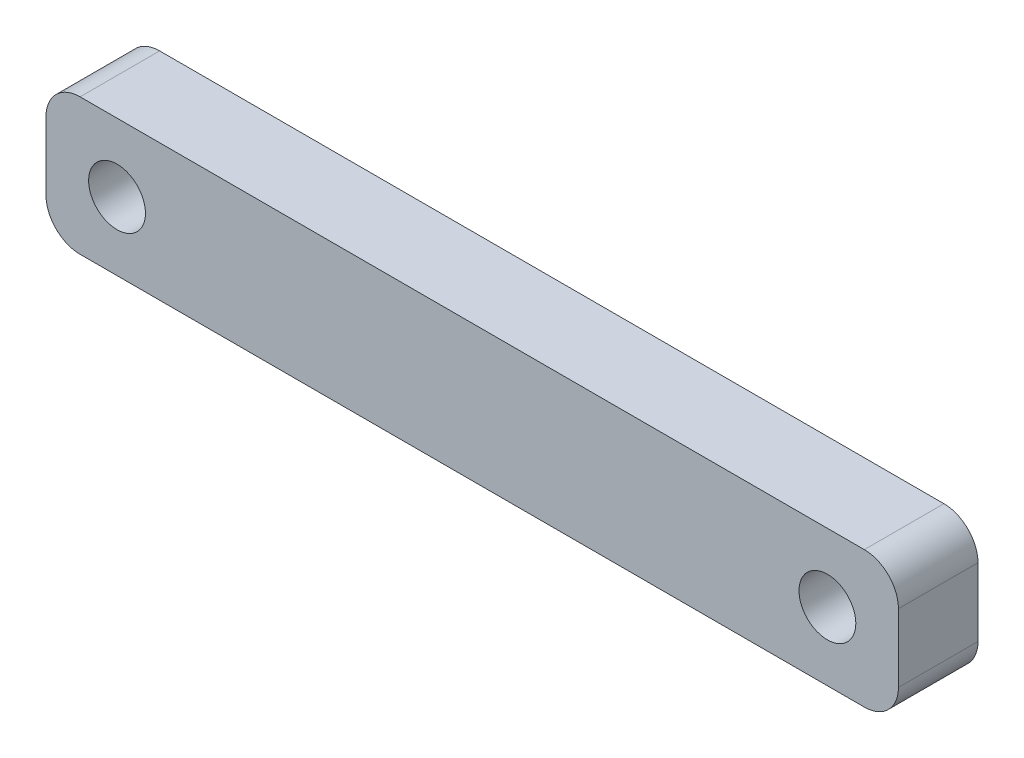
ISO-10303-21;
HEADER;
FILE_DESCRIPTION(('STEP AP214'),'2;1');
FILE_NAME('part.step','',(''),(''),'','','');
FILE_SCHEMA(('AUTOMOTIVE_DESIGN { 1 0 10303 214 1 1 1 1 }'));
ENDSEC;
DATA;
#1=APPLICATION_CONTEXT('core data for automotive mechanical design processes');
#2=APPLICATION_PROTOCOL_DEFINITION('international standard','automotive_design',2000,#1);
#3=PRODUCT_CONTEXT('',#1,'mechanical');
#4=PRODUCT('Part','Part','',(#3));
#5=PRODUCT_RELATED_PRODUCT_CATEGORY('part','',(#4));
#6=PRODUCT_DEFINITION_FORMATION('','',#4);
#7=PRODUCT_DEFINITION_CONTEXT('part definition',#1,'design');
#8=PRODUCT_DEFINITION('design','',#6,#7);
#9=PRODUCT_DEFINITION_SHAPE('','',#8);
#10=(LENGTH_UNIT() NAMED_UNIT(*) SI_UNIT(.MILLI.,.METRE.));
#11=(NAMED_UNIT(*) PLANE_ANGLE_UNIT() SI_UNIT($,.RADIAN.));
#12=(NAMED_UNIT(*) SI_UNIT($,.STERADIAN.) SOLID_ANGLE_UNIT());
#13=UNCERTAINTY_MEASURE_WITH_UNIT(LENGTH_MEASURE(1.E-05),#10,'distance_accuracy_value','');
#14=(GEOMETRIC_REPRESENTATION_CONTEXT(3) GLOBAL_UNCERTAINTY_ASSIGNED_CONTEXT((#13)) GLOBAL_UNIT_ASSIGNED_CONTEXT((#10,
#11,#12)) REPRESENTATION_CONTEXT('',''));
#15=CARTESIAN_POINT('',(0.,0.,0.));
#16=DIRECTION('',(0.,0.,1.));
#17=DIRECTION('',(1.,0.,0.));
#18=AXIS2_PLACEMENT_3D('',#15,#16,#17);
#19=CARTESIAN_POINT('',(0.,0.,7.));
#20=DIRECTION('',(0.,0.,-1.));
#21=DIRECTION('',(-1.,0.,0.));
#22=AXIS2_PLACEMENT_3D('',#19,#20,#21);
#23=PLANE('',#22);
#24=DIRECTION('',(0.,-1.,0.));
#25=VECTOR('',#24,1.);
#26=CARTESIAN_POINT('',(-37.5,-6.,7.));
#27=LINE('',#26,#25);
#28=CARTESIAN_POINT('',(-37.5,3.,7.));
#29=VERTEX_POINT('',#28);
#30=CARTESIAN_POINT('',(-37.5,-3.,7.));
#31=VERTEX_POINT('',#30);
#32=EDGE_CURVE('E172',#29,#31,#27,.T.);
#33=ORIENTED_EDGE('',*,*,#32,.T.);
#34=CARTESIAN_POINT('',(-34.5,-3.,7.));
#35=DIRECTION('',(0.,0.,-1.));
#36=DIRECTION('',(-1.,0.,0.));
#37=AXIS2_PLACEMENT_3D('',#34,#35,#36);
#38=CIRCLE('',#37,3.);
#39=CARTESIAN_POINT('',(-34.5,-6.,7.));
#40=VERTEX_POINT('',#39);
#41=EDGE_CURVE('E149',#31,#40,#38,.F.);
#42=ORIENTED_EDGE('',*,*,#41,.T.);
#43=DIRECTION('',(1.,0.,0.));
#44=VECTOR('',#43,1.);
#45=CARTESIAN_POINT('',(-37.5,-6.,7.));
#46=LINE('',#45,#44);
#47=CARTESIAN_POINT('',(34.5,-6.,7.));
#48=VERTEX_POINT('',#47);
#49=EDGE_CURVE('E120',#40,#48,#46,.T.);
#50=ORIENTED_EDGE('',*,*,#49,.T.);
#51=CARTESIAN_POINT('',(34.5,-3.,7.));
#52=DIRECTION('',(0.,0.,-1.));
#53=DIRECTION('',(-1.,0.,0.));
#54=AXIS2_PLACEMENT_3D('',#51,#52,#53);
#55=CIRCLE('',#54,3.);
#56=CARTESIAN_POINT('',(37.5,-3.,7.));
#57=VERTEX_POINT('',#56);
#58=EDGE_CURVE('E145',#48,#57,#55,.F.);
#59=ORIENTED_EDGE('',*,*,#58,.T.);
#60=DIRECTION('',(0.,1.,0.));
#61=VECTOR('',#60,1.);
#62=CARTESIAN_POINT('',(37.5,-6.,7.));
#63=LINE('',#62,#61);
#64=CARTESIAN_POINT('',(37.5,3.,7.));
#65=VERTEX_POINT('',#64);
#66=EDGE_CURVE('E128',#57,#65,#63,.T.);
#67=ORIENTED_EDGE('',*,*,#66,.T.);
#68=CARTESIAN_POINT('',(34.5,3.,7.));
#69=DIRECTION('',(0.,0.,-1.));
#70=DIRECTION('',(-1.,0.,0.));
#71=AXIS2_PLACEMENT_3D('',#68,#69,#70);
#72=CIRCLE('',#71,3.);
#73=CARTESIAN_POINT('',(34.5,6.,7.));
#74=VERTEX_POINT('',#73);
#75=EDGE_CURVE('E55',#65,#74,#72,.F.);
#76=ORIENTED_EDGE('',*,*,#75,.T.);
#77=DIRECTION('',(-1.,0.,0.));
#78=VECTOR('',#77,1.);
#79=CARTESIAN_POINT('',(-37.5,6.,7.));
#80=LINE('',#79,#78);
#81=CARTESIAN_POINT('',(-34.5,6.,7.));
#82=VERTEX_POINT('',#81);
#83=EDGE_CURVE('E131',#74,#82,#80,.T.);
#84=ORIENTED_EDGE('',*,*,#83,.T.);
#85=CARTESIAN_POINT('',(-34.5,3.,7.));
#86=DIRECTION('',(0.,0.,-1.));
#87=DIRECTION('',(-1.,0.,0.));
#88=AXIS2_PLACEMENT_3D('',#85,#86,#87);
#89=CIRCLE('',#88,3.);
#90=EDGE_CURVE('E147',#82,#29,#89,.F.);
#91=ORIENTED_EDGE('',*,*,#90,.T.);
#92=EDGE_LOOP('',(#33,#42,#50,#59,#67,#76,#84,#91));
#93=FACE_BOUND('',#92,.T.);
#94=CARTESIAN_POINT('',(31.25,0.,7.));
#95=DIRECTION('',(0.,0.,1.));
#96=DIRECTION('',(1.,0.,0.));
#97=AXIS2_PLACEMENT_3D('',#94,#95,#96);
#98=CIRCLE('',#97,2.5);
#99=CARTESIAN_POINT('',(33.75,0.,7.));
#100=VERTEX_POINT('',#99);
#101=EDGE_CURVE('E168',#100,#100,#98,.T.);
#102=ORIENTED_EDGE('',*,*,#101,.F.);
#103=EDGE_LOOP('',(#102));
#104=FACE_BOUND('',#103,.T.);
#105=CARTESIAN_POINT('',(-31.25,0.,7.));
#106=DIRECTION('',(0.,0.,1.));
#107=DIRECTION('',(1.,0.,0.));
#108=AXIS2_PLACEMENT_3D('',#105,#106,#107);
#109=CIRCLE('',#108,2.5);
#110=CARTESIAN_POINT('',(-28.75,0.,7.));
#111=VERTEX_POINT('',#110);
#112=EDGE_CURVE('E178',#111,#111,#109,.T.);
#113=ORIENTED_EDGE('',*,*,#112,.F.);
#114=EDGE_LOOP('',(#113));
#115=FACE_BOUND('',#114,.T.);
#116=ADVANCED_FACE('F33',(#93,#104,#115),#23,.F.);
#117=CARTESIAN_POINT('',(0.,0.,0.));
#118=DIRECTION('',(0.,0.,-1.));
#119=DIRECTION('',(-1.,0.,0.));
#120=AXIS2_PLACEMENT_3D('',#117,#118,#119);
#121=PLANE('',#120);
#122=CARTESIAN_POINT('',(31.25,0.,0.));
#123=DIRECTION('',(0.,0.,1.));
#124=DIRECTION('',(1.,0.,0.));
#125=AXIS2_PLACEMENT_3D('',#122,#123,#124);
#126=CIRCLE('',#125,2.5);
#127=CARTESIAN_POINT('',(33.75,0.,0.));
#128=VERTEX_POINT('',#127);
#129=EDGE_CURVE('E175',#128,#128,#126,.T.);
#130=ORIENTED_EDGE('',*,*,#129,.T.);
#131=EDGE_LOOP('',(#130));
#132=FACE_BOUND('',#131,.T.);
#133=DIRECTION('',(1.,0.,0.));
#134=VECTOR('',#133,1.);
#135=CARTESIAN_POINT('',(-37.5,-6.,0.));
#136=LINE('',#135,#134);
#137=CARTESIAN_POINT('',(-34.5,-6.,0.));
#138=VERTEX_POINT('',#137);
#139=CARTESIAN_POINT('',(34.5,-6.,0.));
#140=VERTEX_POINT('',#139);
#141=EDGE_CURVE('E117',#138,#140,#136,.T.);
#142=ORIENTED_EDGE('',*,*,#141,.F.);
#143=CARTESIAN_POINT('',(-34.5,-3.,0.));
#144=DIRECTION('',(0.,0.,-1.));
#145=DIRECTION('',(-1.,0.,0.));
#146=AXIS2_PLACEMENT_3D('',#143,#144,#145);
#147=CIRCLE('',#146,3.);
#148=CARTESIAN_POINT('',(-37.5,-3.,0.));
#149=VERTEX_POINT('',#148);
#150=EDGE_CURVE('E100',#138,#149,#147,.T.);
#151=ORIENTED_EDGE('',*,*,#150,.T.);
#152=DIRECTION('',(0.,-1.,0.));
#153=VECTOR('',#152,1.);
#154=CARTESIAN_POINT('',(-37.5,-6.,0.));
#155=LINE('',#154,#153);
#156=CARTESIAN_POINT('',(-37.5,3.,0.));
#157=VERTEX_POINT('',#156);
#158=EDGE_CURVE('E129',#157,#149,#155,.T.);
#159=ORIENTED_EDGE('',*,*,#158,.F.);
#160=CARTESIAN_POINT('',(-34.5,3.,0.));
#161=DIRECTION('',(0.,0.,-1.));
#162=DIRECTION('',(-1.,0.,0.));
#163=AXIS2_PLACEMENT_3D('',#160,#161,#162);
#164=CIRCLE('',#163,3.);
#165=CARTESIAN_POINT('',(-34.5,6.,0.));
#166=VERTEX_POINT('',#165);
#167=EDGE_CURVE('E111',#157,#166,#164,.T.);
#168=ORIENTED_EDGE('',*,*,#167,.T.);
#169=DIRECTION('',(-1.,0.,0.));
#170=VECTOR('',#169,1.);
#171=CARTESIAN_POINT('',(-37.5,6.,0.));
#172=LINE('',#171,#170);
#173=CARTESIAN_POINT('',(34.5,6.,0.));
#174=VERTEX_POINT('',#173);
#175=EDGE_CURVE('E133',#174,#166,#172,.T.);
#176=ORIENTED_EDGE('',*,*,#175,.F.);
#177=CARTESIAN_POINT('',(34.5,3.,0.));
#178=DIRECTION('',(0.,0.,-1.));
#179=DIRECTION('',(-1.,0.,0.));
#180=AXIS2_PLACEMENT_3D('',#177,#178,#179);
#181=CIRCLE('',#180,3.);
#182=CARTESIAN_POINT('',(37.5,3.,0.));
#183=VERTEX_POINT('',#182);
#184=EDGE_CURVE('E121',#174,#183,#181,.T.);
#185=ORIENTED_EDGE('',*,*,#184,.T.);
#186=DIRECTION('',(0.,1.,0.));
#187=VECTOR('',#186,1.);
#188=CARTESIAN_POINT('',(37.5,-6.,0.));
#189=LINE('',#188,#187);
#190=CARTESIAN_POINT('',(37.5,-3.,0.));
#191=VERTEX_POINT('',#190);
#192=EDGE_CURVE('E160',#191,#183,#189,.T.);
#193=ORIENTED_EDGE('',*,*,#192,.F.);
#194=CARTESIAN_POINT('',(34.5,-3.,0.));
#195=DIRECTION('',(0.,0.,-1.));
#196=DIRECTION('',(-1.,0.,0.));
#197=AXIS2_PLACEMENT_3D('',#194,#195,#196);
#198=CIRCLE('',#197,3.);
#199=EDGE_CURVE('E127',#191,#140,#198,.T.);
#200=ORIENTED_EDGE('',*,*,#199,.T.);
#201=EDGE_LOOP('',(#142,#151,#159,#168,#176,#185,#193,#200));
#202=FACE_BOUND('',#201,.T.);
#203=CARTESIAN_POINT('',(-31.25,0.,0.));
#204=DIRECTION('',(0.,0.,1.));
#205=DIRECTION('',(1.,0.,0.));
#206=AXIS2_PLACEMENT_3D('',#203,#204,#205);
#207=CIRCLE('',#206,2.5);
#208=CARTESIAN_POINT('',(-28.75,0.,0.));
#209=VERTEX_POINT('',#208);
#210=EDGE_CURVE('E181',#209,#209,#207,.T.);
#211=ORIENTED_EDGE('',*,*,#210,.T.);
#212=EDGE_LOOP('',(#211));
#213=FACE_BOUND('',#212,.T.);
#214=ADVANCED_FACE('F124',(#132,#202,#213),#121,.T.);
#215=CARTESIAN_POINT('',(37.5,-6.,7.));
#216=DIRECTION('',(-1.,0.,0.));
#217=DIRECTION('',(0.,0.,1.));
#218=AXIS2_PLACEMENT_3D('',#215,#216,#217);
#219=PLANE('',#218);
#220=ORIENTED_EDGE('',*,*,#66,.F.);
#221=DIRECTION('',(0.,0.,-1.));
#222=VECTOR('',#221,1.);
#223=CARTESIAN_POINT('',(37.5,-3.,7.));
#224=LINE('',#223,#222);
#225=EDGE_CURVE('E11',#57,#191,#224,.T.);
#226=ORIENTED_EDGE('',*,*,#225,.T.);
#227=ORIENTED_EDGE('',*,*,#192,.T.);
#228=DIRECTION('',(0.,0.,-1.));
#229=VECTOR('',#228,1.);
#230=CARTESIAN_POINT('',(37.5,3.,7.));
#231=LINE('',#230,#229);
#232=EDGE_CURVE('E41',#183,#65,#231,.F.);
#233=ORIENTED_EDGE('',*,*,#232,.T.);
#234=EDGE_LOOP('',(#220,#226,#227,#233));
#235=FACE_BOUND('',#234,.T.);
#236=ADVANCED_FACE('F158',(#235),#219,.F.);
#237=CARTESIAN_POINT('',(-37.5,6.,7.));
#238=DIRECTION('',(0.,-1.,0.));
#239=DIRECTION('',(0.,0.,-1.));
#240=AXIS2_PLACEMENT_3D('',#237,#238,#239);
#241=PLANE('',#240);
#242=ORIENTED_EDGE('',*,*,#175,.T.);
#243=DIRECTION('',(0.,0.,-1.));
#244=VECTOR('',#243,1.);
#245=CARTESIAN_POINT('',(-34.5,6.,7.));
#246=LINE('',#245,#244);
#247=EDGE_CURVE('E48',#166,#82,#246,.F.);
#248=ORIENTED_EDGE('',*,*,#247,.T.);
#249=ORIENTED_EDGE('',*,*,#83,.F.);
#250=DIRECTION('',(0.,0.,-1.));
#251=VECTOR('',#250,1.);
#252=CARTESIAN_POINT('',(34.5,6.,7.));
#253=LINE('',#252,#251);
#254=EDGE_CURVE('E151',#74,#174,#253,.T.);
#255=ORIENTED_EDGE('',*,*,#254,.T.);
#256=EDGE_LOOP('',(#242,#248,#249,#255));
#257=FACE_BOUND('',#256,.T.);
#258=ADVANCED_FACE('F167',(#257),#241,.F.);
#259=CARTESIAN_POINT('',(-37.5,-6.,7.));
#260=DIRECTION('',(1.,0.,0.));
#261=DIRECTION('',(0.,0.,-1.));
#262=AXIS2_PLACEMENT_3D('',#259,#260,#261);
#263=PLANE('',#262);
#264=ORIENTED_EDGE('',*,*,#158,.T.);
#265=DIRECTION('',(0.,0.,-1.));
#266=VECTOR('',#265,1.);
#267=CARTESIAN_POINT('',(-37.5,-3.,7.));
#268=LINE('',#267,#266);
#269=EDGE_CURVE('E105',#149,#31,#268,.F.);
#270=ORIENTED_EDGE('',*,*,#269,.T.);
#271=ORIENTED_EDGE('',*,*,#32,.F.);
#272=DIRECTION('',(0.,0.,-1.));
#273=VECTOR('',#272,1.);
#274=CARTESIAN_POINT('',(-37.5,3.,7.));
#275=LINE('',#274,#273);
#276=EDGE_CURVE('E110',#29,#157,#275,.T.);
#277=ORIENTED_EDGE('',*,*,#276,.T.);
#278=EDGE_LOOP('',(#264,#270,#271,#277));
#279=FACE_BOUND('',#278,.T.);
#280=ADVANCED_FACE('F203',(#279),#263,.F.);
#281=CARTESIAN_POINT('',(-37.5,-6.,7.));
#282=DIRECTION('',(0.,1.,0.));
#283=DIRECTION('',(0.,0.,1.));
#284=AXIS2_PLACEMENT_3D('',#281,#282,#283);
#285=PLANE('',#284);
#286=ORIENTED_EDGE('',*,*,#49,.F.);
#287=DIRECTION('',(0.,0.,-1.));
#288=VECTOR('',#287,1.);
#289=CARTESIAN_POINT('',(-34.5,-6.,7.));
#290=LINE('',#289,#288);
#291=EDGE_CURVE('E104',#40,#138,#290,.T.);
#292=ORIENTED_EDGE('',*,*,#291,.T.);
#293=ORIENTED_EDGE('',*,*,#141,.T.);
#294=DIRECTION('',(0.,0.,-1.));
#295=VECTOR('',#294,1.);
#296=CARTESIAN_POINT('',(34.5,-6.,7.));
#297=LINE('',#296,#295);
#298=EDGE_CURVE('E122',#140,#48,#297,.F.);
#299=ORIENTED_EDGE('',*,*,#298,.T.);
#300=EDGE_LOOP('',(#286,#292,#293,#299));
#301=FACE_BOUND('',#300,.T.);
#302=ADVANCED_FACE('F116',(#301),#285,.F.);
#303=CARTESIAN_POINT('',(31.25,0.,7.));
#304=DIRECTION('',(0.,0.,-1.));
#305=DIRECTION('',(-1.,0.,0.));
#306=AXIS2_PLACEMENT_3D('',#303,#304,#305);
#307=CYLINDRICAL_SURFACE('',#306,2.5);
#308=ORIENTED_EDGE('',*,*,#101,.T.);
#309=EDGE_LOOP('',(#308));
#310=FACE_BOUND('',#309,.T.);
#311=ORIENTED_EDGE('',*,*,#129,.F.);
#312=EDGE_LOOP('',(#311));
#313=FACE_BOUND('',#312,.T.);
#314=ADVANCED_FACE('F198',(#310,#313),#307,.F.);
#315=CARTESIAN_POINT('',(-31.25,0.,7.));
#316=DIRECTION('',(0.,0.,-1.));
#317=DIRECTION('',(-1.,0.,0.));
#318=AXIS2_PLACEMENT_3D('',#315,#316,#317);
#319=CYLINDRICAL_SURFACE('',#318,2.5);
#320=ORIENTED_EDGE('',*,*,#112,.T.);
#321=EDGE_LOOP('',(#320));
#322=FACE_BOUND('',#321,.T.);
#323=ORIENTED_EDGE('',*,*,#210,.F.);
#324=EDGE_LOOP('',(#323));
#325=FACE_BOUND('',#324,.T.);
#326=ADVANCED_FACE('F187',(#322,#325),#319,.F.);
#327=CARTESIAN_POINT('',(-34.5,-3.,7.));
#328=DIRECTION('',(0.,0.,-1.));
#329=DIRECTION('',(-1.,0.,0.));
#330=AXIS2_PLACEMENT_3D('',#327,#328,#329);
#331=CYLINDRICAL_SURFACE('',#330,3.);
#332=ORIENTED_EDGE('',*,*,#41,.F.);
#333=ORIENTED_EDGE('',*,*,#269,.F.);
#334=ORIENTED_EDGE('',*,*,#150,.F.);
#335=ORIENTED_EDGE('',*,*,#291,.F.);
#336=EDGE_LOOP('',(#332,#333,#334,#335));
#337=FACE_BOUND('',#336,.T.);
#338=ADVANCED_FACE('F103',(#337),#331,.T.);
#339=CARTESIAN_POINT('',(-34.5,3.,7.));
#340=DIRECTION('',(0.,0.,-1.));
#341=DIRECTION('',(-1.,0.,0.));
#342=AXIS2_PLACEMENT_3D('',#339,#340,#341);
#343=CYLINDRICAL_SURFACE('',#342,3.);
#344=ORIENTED_EDGE('',*,*,#90,.F.);
#345=ORIENTED_EDGE('',*,*,#247,.F.);
#346=ORIENTED_EDGE('',*,*,#167,.F.);
#347=ORIENTED_EDGE('',*,*,#276,.F.);
#348=EDGE_LOOP('',(#344,#345,#346,#347));
#349=FACE_BOUND('',#348,.T.);
#350=ADVANCED_FACE('F213',(#349),#343,.T.);
#351=CARTESIAN_POINT('',(34.5,-3.,7.));
#352=DIRECTION('',(0.,0.,-1.));
#353=DIRECTION('',(-1.,0.,0.));
#354=AXIS2_PLACEMENT_3D('',#351,#352,#353);
#355=CYLINDRICAL_SURFACE('',#354,3.);
#356=ORIENTED_EDGE('',*,*,#58,.F.);
#357=ORIENTED_EDGE('',*,*,#298,.F.);
#358=ORIENTED_EDGE('',*,*,#199,.F.);
#359=ORIENTED_EDGE('',*,*,#225,.F.);
#360=EDGE_LOOP('',(#356,#357,#358,#359));
#361=FACE_BOUND('',#360,.T.);
#362=ADVANCED_FACE('F215',(#361),#355,.T.);
#363=CARTESIAN_POINT('',(34.5,3.,7.));
#364=DIRECTION('',(0.,0.,-1.));
#365=DIRECTION('',(-1.,0.,0.));
#366=AXIS2_PLACEMENT_3D('',#363,#364,#365);
#367=CYLINDRICAL_SURFACE('',#366,3.);
#368=ORIENTED_EDGE('',*,*,#75,.F.);
#369=ORIENTED_EDGE('',*,*,#232,.F.);
#370=ORIENTED_EDGE('',*,*,#184,.F.);
#371=ORIENTED_EDGE('',*,*,#254,.F.);
#372=EDGE_LOOP('',(#368,#369,#370,#371));
#373=FACE_BOUND('',#372,.T.);
#374=ADVANCED_FACE('F35',(#373),#367,.T.);
#375=CLOSED_SHELL('',(#116,#214,#236,#258,#280,#302,#314,#326,#338,#350,#362,#374));
#376=MANIFOLD_SOLID_BREP('B2',#375);
#377=ADVANCED_BREP_SHAPE_REPRESENTATION('',(#18,#376),#14);
#378=SHAPE_DEFINITION_REPRESENTATION(#9,#377);
ENDSEC;
END-ISO-10303-21;
